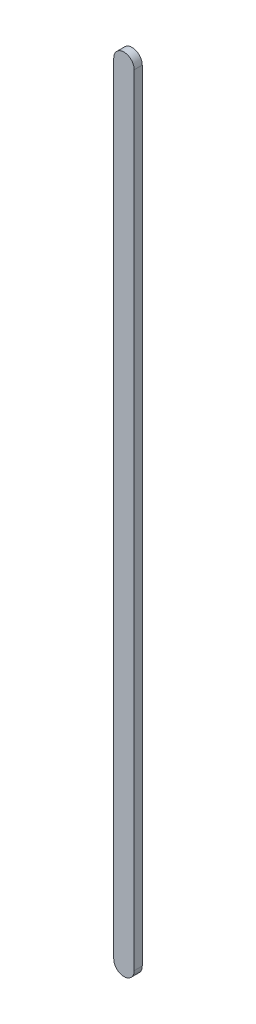
ISO-10303-21;
HEADER;
FILE_DESCRIPTION(('STEP AP214'),'2;1');
FILE_NAME('part.step','',(''),(''),'','','');
FILE_SCHEMA(('AUTOMOTIVE_DESIGN { 1 0 10303 214 1 1 1 1 }'));
ENDSEC;
DATA;
#1=APPLICATION_CONTEXT('core data for automotive mechanical design processes');
#2=APPLICATION_PROTOCOL_DEFINITION('international standard','automotive_design',2000,#1);
#3=PRODUCT_CONTEXT('',#1,'mechanical');
#4=PRODUCT('Part','Part','',(#3));
#5=PRODUCT_RELATED_PRODUCT_CATEGORY('part','',(#4));
#6=PRODUCT_DEFINITION_FORMATION('','',#4);
#7=PRODUCT_DEFINITION_CONTEXT('part definition',#1,'design');
#8=PRODUCT_DEFINITION('design','',#6,#7);
#9=PRODUCT_DEFINITION_SHAPE('','',#8);
#10=(LENGTH_UNIT() NAMED_UNIT(*) SI_UNIT(.MILLI.,.METRE.));
#11=(NAMED_UNIT(*) PLANE_ANGLE_UNIT() SI_UNIT($,.RADIAN.));
#12=(NAMED_UNIT(*) SI_UNIT($,.STERADIAN.) SOLID_ANGLE_UNIT());
#13=UNCERTAINTY_MEASURE_WITH_UNIT(LENGTH_MEASURE(1.E-05),#10,'distance_accuracy_value','');
#14=(GEOMETRIC_REPRESENTATION_CONTEXT(3) GLOBAL_UNCERTAINTY_ASSIGNED_CONTEXT((#13)) GLOBAL_UNIT_ASSIGNED_CONTEXT((#10,
#11,#12)) REPRESENTATION_CONTEXT('',''));
#15=CARTESIAN_POINT('',(0.,0.,0.));
#16=DIRECTION('',(0.,0.,1.));
#17=DIRECTION('',(1.,0.,0.));
#18=AXIS2_PLACEMENT_3D('',#15,#16,#17);
#19=CARTESIAN_POINT('',(137.033,84.582,0.));
#20=DIRECTION('',(-1.,0.,0.));
#21=DIRECTION('',(0.,1.,0.));
#22=AXIS2_PLACEMENT_3D('',#19,#20,#21);
#23=PLANE('',#22);
#24=DIRECTION('',(0.,1.,0.));
#25=VECTOR('',#24,1.);
#26=CARTESIAN_POINT('',(137.033,84.582,0.1999996));
#27=LINE('',#26,#25);
#28=CARTESIAN_POINT('',(137.033,84.582,0.1999996));
#29=VERTEX_POINT('',#28);
#30=CARTESIAN_POINT('',(137.033,103.9622,0.1999996));
#31=VERTEX_POINT('',#30);
#32=EDGE_CURVE('E11',#29,#31,#27,.T.);
#33=ORIENTED_EDGE('',*,*,#32,.F.);
#34=DIRECTION('',(0.,0.,1.));
#35=VECTOR('',#34,1.);
#36=CARTESIAN_POINT('',(137.033,84.582,0.));
#37=LINE('',#36,#35);
#38=CARTESIAN_POINT('',(137.033,84.582,0.));
#39=VERTEX_POINT('',#38);
#40=EDGE_CURVE('E24',#39,#29,#37,.T.);
#41=ORIENTED_EDGE('',*,*,#40,.F.);
#42=DIRECTION('',(0.,1.,0.));
#43=VECTOR('',#42,1.);
#44=CARTESIAN_POINT('',(137.033,84.582,0.));
#45=LINE('',#44,#43);
#46=CARTESIAN_POINT('',(137.033,103.9622,0.));
#47=VERTEX_POINT('',#46);
#48=EDGE_CURVE('E75',#39,#47,#45,.T.);
#49=ORIENTED_EDGE('',*,*,#48,.T.);
#50=DIRECTION('',(0.,0.,1.));
#51=VECTOR('',#50,1.);
#52=CARTESIAN_POINT('',(137.033,103.9622,0.));
#53=LINE('',#52,#51);
#54=EDGE_CURVE('E37',#47,#31,#53,.T.);
#55=ORIENTED_EDGE('',*,*,#54,.T.);
#56=EDGE_LOOP('',(#33,#41,#49,#55));
#57=FACE_BOUND('',#56,.T.);
#58=ADVANCED_FACE('F17',(#57),#23,.F.);
#59=CARTESIAN_POINT('',(136.779,103.9622,0.));
#60=DIRECTION('',(0.,0.,-1.));
#61=DIRECTION('',(1.,0.,0.));
#62=AXIS2_PLACEMENT_3D('',#59,#60,#61);
#63=CYLINDRICAL_SURFACE('',#62,0.253999999999995);
#64=CARTESIAN_POINT('',(136.779,103.9622,0.1999996));
#65=DIRECTION('',(0.,0.,1.));
#66=DIRECTION('',(1.,0.,0.));
#67=AXIS2_PLACEMENT_3D('',#64,#65,#66);
#68=CIRCLE('',#67,0.253999999999995);
#69=CARTESIAN_POINT('',(136.525,103.9622,0.1999996));
#70=VERTEX_POINT('',#69);
#71=EDGE_CURVE('E83',#31,#70,#68,.T.);
#72=ORIENTED_EDGE('',*,*,#71,.F.);
#73=ORIENTED_EDGE('',*,*,#54,.F.);
#74=CARTESIAN_POINT('',(136.779,103.9622,0.));
#75=DIRECTION('',(0.,0.,1.));
#76=DIRECTION('',(1.,0.,0.));
#77=AXIS2_PLACEMENT_3D('',#74,#75,#76);
#78=CIRCLE('',#77,0.253999999999995);
#79=CARTESIAN_POINT('',(136.525,103.9622,0.));
#80=VERTEX_POINT('',#79);
#81=EDGE_CURVE('E81',#47,#80,#78,.T.);
#82=ORIENTED_EDGE('',*,*,#81,.T.);
#83=DIRECTION('',(0.,0.,1.));
#84=VECTOR('',#83,1.);
#85=CARTESIAN_POINT('',(136.525,103.9622,0.));
#86=LINE('',#85,#84);
#87=EDGE_CURVE('E67',#80,#70,#86,.T.);
#88=ORIENTED_EDGE('',*,*,#87,.T.);
#89=EDGE_LOOP('',(#72,#73,#82,#88));
#90=FACE_BOUND('',#89,.T.);
#91=ADVANCED_FACE('F89',(#90),#63,.T.);
#92=CARTESIAN_POINT('',(136.525,103.9622,0.));
#93=DIRECTION('',(1.,0.,0.));
#94=DIRECTION('',(0.,-1.,0.));
#95=AXIS2_PLACEMENT_3D('',#92,#93,#94);
#96=PLANE('',#95);
#97=DIRECTION('',(0.,-1.,0.));
#98=VECTOR('',#97,1.);
#99=CARTESIAN_POINT('',(136.525,103.9622,0.1999996));
#100=LINE('',#99,#98);
#101=CARTESIAN_POINT('',(136.525,84.582,0.1999996));
#102=VERTEX_POINT('',#101);
#103=EDGE_CURVE('E71',#70,#102,#100,.T.);
#104=ORIENTED_EDGE('',*,*,#103,.F.);
#105=ORIENTED_EDGE('',*,*,#87,.F.);
#106=DIRECTION('',(0.,-1.,0.));
#107=VECTOR('',#106,1.);
#108=CARTESIAN_POINT('',(136.525,103.9622,0.));
#109=LINE('',#108,#107);
#110=CARTESIAN_POINT('',(136.525,84.582,0.));
#111=VERTEX_POINT('',#110);
#112=EDGE_CURVE('E63',#80,#111,#109,.T.);
#113=ORIENTED_EDGE('',*,*,#112,.T.);
#114=DIRECTION('',(0.,0.,1.));
#115=VECTOR('',#114,1.);
#116=CARTESIAN_POINT('',(136.525,84.582,0.));
#117=LINE('',#116,#115);
#118=EDGE_CURVE('E53',#111,#102,#117,.T.);
#119=ORIENTED_EDGE('',*,*,#118,.T.);
#120=EDGE_LOOP('',(#104,#105,#113,#119));
#121=FACE_BOUND('',#120,.T.);
#122=ADVANCED_FACE('F66',(#121),#96,.F.);
#123=CARTESIAN_POINT('',(136.779,84.582,0.));
#124=DIRECTION('',(0.,0.,-1.));
#125=DIRECTION('',(-1.,0.,0.));
#126=AXIS2_PLACEMENT_3D('',#123,#124,#125);
#127=CYLINDRICAL_SURFACE('',#126,0.253999999999995);
#128=CARTESIAN_POINT('',(136.779,84.582,0.1999996));
#129=DIRECTION('',(0.,0.,1.));
#130=DIRECTION('',(-1.,0.,0.));
#131=AXIS2_PLACEMENT_3D('',#128,#129,#130);
#132=CIRCLE('',#131,0.253999999999995);
#133=EDGE_CURVE('E59',#102,#29,#132,.T.);
#134=ORIENTED_EDGE('',*,*,#133,.F.);
#135=ORIENTED_EDGE('',*,*,#118,.F.);
#136=CARTESIAN_POINT('',(136.779,84.582,0.));
#137=DIRECTION('',(0.,0.,1.));
#138=DIRECTION('',(-1.,0.,0.));
#139=AXIS2_PLACEMENT_3D('',#136,#137,#138);
#140=CIRCLE('',#139,0.253999999999995);
#141=EDGE_CURVE('E57',#111,#39,#140,.T.);
#142=ORIENTED_EDGE('',*,*,#141,.T.);
#143=ORIENTED_EDGE('',*,*,#40,.T.);
#144=EDGE_LOOP('',(#134,#135,#142,#143));
#145=FACE_BOUND('',#144,.T.);
#146=ADVANCED_FACE('F55',(#145),#127,.T.);
#147=CARTESIAN_POINT('',(137.033,84.582,0.));
#148=DIRECTION('',(0.,0.,-1.));
#149=DIRECTION('',(-1.,0.,0.));
#150=AXIS2_PLACEMENT_3D('',#147,#148,#149);
#151=PLANE('',#150);
#152=ORIENTED_EDGE('',*,*,#141,.F.);
#153=ORIENTED_EDGE('',*,*,#112,.F.);
#154=ORIENTED_EDGE('',*,*,#81,.F.);
#155=ORIENTED_EDGE('',*,*,#48,.F.);
#156=EDGE_LOOP('',(#152,#153,#154,#155));
#157=FACE_BOUND('',#156,.T.);
#158=ADVANCED_FACE('F74',(#157),#151,.T.);
#159=CARTESIAN_POINT('',(137.033,84.582,0.1999996));
#160=DIRECTION('',(0.,0.,-1.));
#161=DIRECTION('',(-1.,0.,0.));
#162=AXIS2_PLACEMENT_3D('',#159,#160,#161);
#163=PLANE('',#162);
#164=ORIENTED_EDGE('',*,*,#32,.T.);
#165=ORIENTED_EDGE('',*,*,#71,.T.);
#166=ORIENTED_EDGE('',*,*,#103,.T.);
#167=ORIENTED_EDGE('',*,*,#133,.T.);
#168=EDGE_LOOP('',(#164,#165,#166,#167));
#169=FACE_BOUND('',#168,.T.);
#170=ADVANCED_FACE('F91',(#169),#163,.F.);
#171=CLOSED_SHELL('',(#58,#91,#122,#146,#158,#170));
#172=MANIFOLD_SOLID_BREP('B1',#171);
#173=ADVANCED_BREP_SHAPE_REPRESENTATION('',(#18,#172),#14);
#174=SHAPE_DEFINITION_REPRESENTATION(#9,#173);
ENDSEC;
END-ISO-10303-21;
